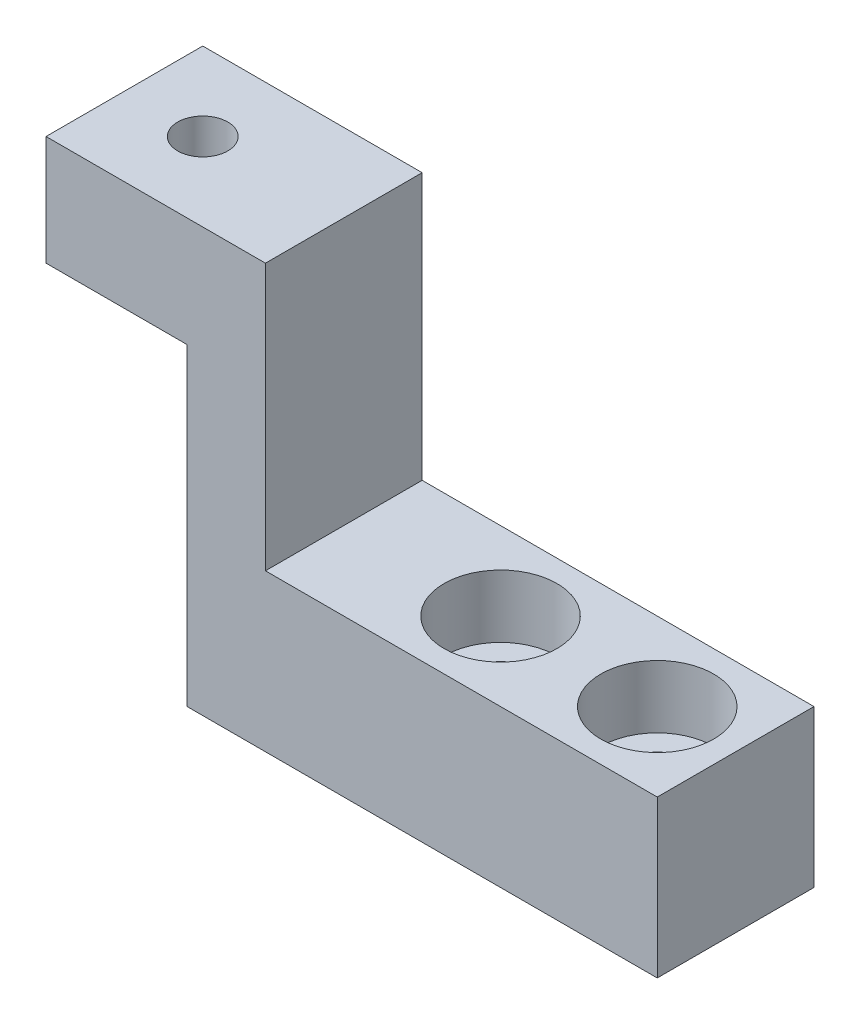
ISO-10303-21;
HEADER;
FILE_DESCRIPTION(('STEP AP214'),'2;1');
FILE_NAME('part.step','',(''),(''),'','','');
FILE_SCHEMA(('AUTOMOTIVE_DESIGN { 1 0 10303 214 1 1 1 1 }'));
ENDSEC;
DATA;
#1=APPLICATION_CONTEXT('core data for automotive mechanical design processes');
#2=APPLICATION_PROTOCOL_DEFINITION('international standard','automotive_design',2000,#1);
#3=PRODUCT_CONTEXT('',#1,'mechanical');
#4=PRODUCT('Part','Part','',(#3));
#5=PRODUCT_RELATED_PRODUCT_CATEGORY('part','',(#4));
#6=PRODUCT_DEFINITION_FORMATION('','',#4);
#7=PRODUCT_DEFINITION_CONTEXT('part definition',#1,'design');
#8=PRODUCT_DEFINITION('design','',#6,#7);
#9=PRODUCT_DEFINITION_SHAPE('','',#8);
#10=(LENGTH_UNIT() NAMED_UNIT(*) SI_UNIT(.MILLI.,.METRE.));
#11=(NAMED_UNIT(*) PLANE_ANGLE_UNIT() SI_UNIT($,.RADIAN.));
#12=(NAMED_UNIT(*) SI_UNIT($,.STERADIAN.) SOLID_ANGLE_UNIT());
#13=UNCERTAINTY_MEASURE_WITH_UNIT(LENGTH_MEASURE(1.E-05),#10,'distance_accuracy_value','');
#14=(GEOMETRIC_REPRESENTATION_CONTEXT(3) GLOBAL_UNCERTAINTY_ASSIGNED_CONTEXT((#13)) GLOBAL_UNIT_ASSIGNED_CONTEXT((#10,
#11,#12)) REPRESENTATION_CONTEXT('',''));
#15=CARTESIAN_POINT('',(0.,0.,0.));
#16=DIRECTION('',(0.,0.,1.));
#17=DIRECTION('',(1.,0.,0.));
#18=AXIS2_PLACEMENT_3D('',#15,#16,#17);
#19=CARTESIAN_POINT('',(-5.,-0.001000000000001,5.));
#20=DIRECTION('',(0.,1.,0.));
#21=DIRECTION('',(0.,0.,1.));
#22=AXIS2_PLACEMENT_3D('',#19,#20,#21);
#23=CYLINDRICAL_SURFACE('',#22,2.1);
#24=CARTESIAN_POINT('',(-5.,0.,5.));
#25=DIRECTION('',(0.,-1.,0.));
#26=DIRECTION('',(1.,0.,0.));
#27=AXIS2_PLACEMENT_3D('',#24,#25,#26);
#28=CIRCLE('',#27,2.1);
#29=CARTESIAN_POINT('',(-2.9,0.,5.));
#30=VERTEX_POINT('',#29);
#31=EDGE_CURVE('E122',#30,#30,#28,.F.);
#32=ORIENTED_EDGE('',*,*,#31,.F.);
#33=EDGE_LOOP('',(#32));
#34=FACE_BOUND('',#33,.T.);
#35=CARTESIAN_POINT('',(-5.,6.,5.));
#36=DIRECTION('',(0.,1.,0.));
#37=DIRECTION('',(0.,0.,1.));
#38=AXIS2_PLACEMENT_3D('',#35,#36,#37);
#39=CIRCLE('',#38,2.1);
#40=CARTESIAN_POINT('',(-5.,6.,7.10000000000001));
#41=VERTEX_POINT('',#40);
#42=EDGE_CURVE('E40',#41,#41,#39,.F.);
#43=ORIENTED_EDGE('',*,*,#42,.F.);
#44=EDGE_LOOP('',(#43));
#45=FACE_BOUND('',#44,.T.);
#46=ADVANCED_FACE('F36',(#34,#45),#23,.F.);
#47=CARTESIAN_POINT('',(-15.,0.,5.));
#48=DIRECTION('',(0.,1.,0.));
#49=DIRECTION('',(0.,0.,1.));
#50=AXIS2_PLACEMENT_3D('',#47,#48,#49);
#51=CYLINDRICAL_SURFACE('',#50,2.1);
#52=CARTESIAN_POINT('',(-15.,0.,5.));
#53=DIRECTION('',(0.,1.,0.));
#54=DIRECTION('',(0.,0.,1.));
#55=AXIS2_PLACEMENT_3D('',#52,#53,#54);
#56=CIRCLE('',#55,2.1);
#57=CARTESIAN_POINT('',(-15.,0.,7.10000000000001));
#58=VERTEX_POINT('',#57);
#59=EDGE_CURVE('E125',#58,#58,#56,.T.);
#60=ORIENTED_EDGE('',*,*,#59,.F.);
#61=EDGE_LOOP('',(#60));
#62=FACE_BOUND('',#61,.T.);
#63=CARTESIAN_POINT('',(-15.,6.,5.));
#64=DIRECTION('',(0.,1.,0.));
#65=DIRECTION('',(0.,0.,1.));
#66=AXIS2_PLACEMENT_3D('',#63,#64,#65);
#67=CIRCLE('',#66,2.1);
#68=CARTESIAN_POINT('',(-15.,6.,7.10000000000001));
#69=VERTEX_POINT('',#68);
#70=EDGE_CURVE('E169',#69,#69,#67,.F.);
#71=ORIENTED_EDGE('',*,*,#70,.F.);
#72=EDGE_LOOP('',(#71));
#73=FACE_BOUND('',#72,.T.);
#74=ADVANCED_FACE('F231',(#62,#73),#51,.F.);
#75=CARTESIAN_POINT('',(0.,10.,10.));
#76=DIRECTION('',(1.,0.,0.));
#77=DIRECTION('',(0.,1.,0.));
#78=AXIS2_PLACEMENT_3D('',#75,#76,#77);
#79=PLANE('',#78);
#80=DIRECTION('',(0.,-1.,0.));
#81=VECTOR('',#80,1.);
#82=CARTESIAN_POINT('',(0.,10.,0.));
#83=LINE('',#82,#81);
#84=CARTESIAN_POINT('',(0.,10.,0.));
#85=VERTEX_POINT('',#84);
#86=CARTESIAN_POINT('',(0.,0.,0.));
#87=VERTEX_POINT('',#86);
#88=EDGE_CURVE('E102',#85,#87,#83,.T.);
#89=ORIENTED_EDGE('',*,*,#88,.F.);
#90=DIRECTION('',(0.,0.,-1.));
#91=VECTOR('',#90,1.);
#92=CARTESIAN_POINT('',(0.,10.,10.));
#93=LINE('',#92,#91);
#94=CARTESIAN_POINT('',(0.,10.,10.));
#95=VERTEX_POINT('',#94);
#96=EDGE_CURVE('E11',#95,#85,#93,.T.);
#97=ORIENTED_EDGE('',*,*,#96,.F.);
#98=DIRECTION('',(0.,-1.,0.));
#99=VECTOR('',#98,1.);
#100=CARTESIAN_POINT('',(0.,10.,10.));
#101=LINE('',#100,#99);
#102=CARTESIAN_POINT('',(0.,0.,10.));
#103=VERTEX_POINT('',#102);
#104=EDGE_CURVE('E104',#95,#103,#101,.T.);
#105=ORIENTED_EDGE('',*,*,#104,.T.);
#106=DIRECTION('',(0.,0.,-1.));
#107=VECTOR('',#106,1.);
#108=CARTESIAN_POINT('',(0.,0.,10.));
#109=LINE('',#108,#107);
#110=EDGE_CURVE('E99',#103,#87,#109,.T.);
#111=ORIENTED_EDGE('',*,*,#110,.T.);
#112=EDGE_LOOP('',(#89,#97,#105,#111));
#113=FACE_BOUND('',#112,.T.);
#114=ADVANCED_FACE('F38',(#113),#79,.T.);
#115=CARTESIAN_POINT('',(-25.,9.99999999999997,10.));
#116=DIRECTION('',(0.,1.,0.));
#117=DIRECTION('',(0.,0.,1.));
#118=AXIS2_PLACEMENT_3D('',#115,#116,#117);
#119=PLANE('',#118);
#120=CARTESIAN_POINT('',(-5.,10.,5.));
#121=DIRECTION('',(0.,1.,0.));
#122=DIRECTION('',(0.,0.,1.));
#123=AXIS2_PLACEMENT_3D('',#120,#121,#122);
#124=CIRCLE('',#123,3.6);
#125=CARTESIAN_POINT('',(-5.,10.,8.60000000000001));
#126=VERTEX_POINT('',#125);
#127=EDGE_CURVE('E186',#126,#126,#124,.T.);
#128=ORIENTED_EDGE('',*,*,#127,.F.);
#129=EDGE_LOOP('',(#128));
#130=FACE_BOUND('',#129,.T.);
#131=CARTESIAN_POINT('',(-15.,9.99999999999997,5.));
#132=DIRECTION('',(0.,1.,0.));
#133=DIRECTION('',(0.,0.,1.));
#134=AXIS2_PLACEMENT_3D('',#131,#132,#133);
#135=CIRCLE('',#134,3.6);
#136=CARTESIAN_POINT('',(-15.,9.99999999999997,8.6));
#137=VERTEX_POINT('',#136);
#138=EDGE_CURVE('E176',#137,#137,#135,.T.);
#139=ORIENTED_EDGE('',*,*,#138,.F.);
#140=EDGE_LOOP('',(#139));
#141=FACE_BOUND('',#140,.T.);
#142=DIRECTION('',(1.,0.,0.));
#143=VECTOR('',#142,1.);
#144=CARTESIAN_POINT('',(-25.,10.,0.));
#145=LINE('',#144,#143);
#146=CARTESIAN_POINT('',(-25.,10.,0.));
#147=VERTEX_POINT('',#146);
#148=EDGE_CURVE('E121',#147,#85,#145,.T.);
#149=ORIENTED_EDGE('',*,*,#148,.F.);
#150=DIRECTION('',(0.,0.,-1.));
#151=VECTOR('',#150,1.);
#152=CARTESIAN_POINT('',(-25.,9.99999999999997,10.));
#153=LINE('',#152,#151);
#154=CARTESIAN_POINT('',(-25.,9.99999999999997,10.));
#155=VERTEX_POINT('',#154);
#156=EDGE_CURVE('E45',#155,#147,#153,.T.);
#157=ORIENTED_EDGE('',*,*,#156,.F.);
#158=DIRECTION('',(1.,0.,0.));
#159=VECTOR('',#158,1.);
#160=CARTESIAN_POINT('',(-25.,9.99999999999997,10.));
#161=LINE('',#160,#159);
#162=EDGE_CURVE('E109',#155,#95,#161,.T.);
#163=ORIENTED_EDGE('',*,*,#162,.T.);
#164=ORIENTED_EDGE('',*,*,#96,.T.);
#165=EDGE_LOOP('',(#149,#157,#163,#164));
#166=FACE_BOUND('',#165,.T.);
#167=ADVANCED_FACE('F221',(#130,#141,#166),#119,.T.);
#168=CARTESIAN_POINT('',(-25.,27.,10.));
#169=DIRECTION('',(1.,0.,0.));
#170=DIRECTION('',(0.,1.,0.));
#171=AXIS2_PLACEMENT_3D('',#168,#169,#170);
#172=PLANE('',#171);
#173=DIRECTION('',(0.,-1.,0.));
#174=VECTOR('',#173,1.);
#175=CARTESIAN_POINT('',(-25.,27.,0.));
#176=LINE('',#175,#174);
#177=CARTESIAN_POINT('',(-25.,27.,0.));
#178=VERTEX_POINT('',#177);
#179=EDGE_CURVE('E139',#178,#147,#176,.T.);
#180=ORIENTED_EDGE('',*,*,#179,.F.);
#181=DIRECTION('',(0.,0.,-1.));
#182=VECTOR('',#181,1.);
#183=CARTESIAN_POINT('',(-25.,27.,10.));
#184=LINE('',#183,#182);
#185=CARTESIAN_POINT('',(-25.,27.,10.));
#186=VERTEX_POINT('',#185);
#187=EDGE_CURVE('E161',#186,#178,#184,.T.);
#188=ORIENTED_EDGE('',*,*,#187,.F.);
#189=DIRECTION('',(0.,-1.,0.));
#190=VECTOR('',#189,1.);
#191=CARTESIAN_POINT('',(-25.,27.,10.));
#192=LINE('',#191,#190);
#193=EDGE_CURVE('E157',#186,#155,#192,.T.);
#194=ORIENTED_EDGE('',*,*,#193,.T.);
#195=ORIENTED_EDGE('',*,*,#156,.T.);
#196=EDGE_LOOP('',(#180,#188,#194,#195));
#197=FACE_BOUND('',#196,.T.);
#198=ADVANCED_FACE('F202',(#197),#172,.T.);
#199=CARTESIAN_POINT('',(-39.,27.,10.));
#200=DIRECTION('',(0.,1.,0.));
#201=DIRECTION('',(0.,0.,1.));
#202=AXIS2_PLACEMENT_3D('',#199,#200,#201);
#203=PLANE('',#202);
#204=CARTESIAN_POINT('',(-34.,27.,4.99999999999989));
#205=DIRECTION('',(0.,1.,0.));
#206=DIRECTION('',(0.,0.,1.));
#207=AXIS2_PLACEMENT_3D('',#204,#205,#206);
#208=CIRCLE('',#207,1.6);
#209=CARTESIAN_POINT('',(-34.,27.,6.59999999999995));
#210=VERTEX_POINT('',#209);
#211=EDGE_CURVE('E189',#210,#210,#208,.T.);
#212=ORIENTED_EDGE('',*,*,#211,.F.);
#213=EDGE_LOOP('',(#212));
#214=FACE_BOUND('',#213,.T.);
#215=DIRECTION('',(1.,0.,0.));
#216=VECTOR('',#215,1.);
#217=CARTESIAN_POINT('',(-39.,27.,0.));
#218=LINE('',#217,#216);
#219=CARTESIAN_POINT('',(-39.,27.,0.));
#220=VERTEX_POINT('',#219);
#221=EDGE_CURVE('E136',#220,#178,#218,.T.);
#222=ORIENTED_EDGE('',*,*,#221,.F.);
#223=DIRECTION('',(0.,0.,-1.));
#224=VECTOR('',#223,1.);
#225=CARTESIAN_POINT('',(-39.,27.,10.));
#226=LINE('',#225,#224);
#227=CARTESIAN_POINT('',(-39.,27.,10.));
#228=VERTEX_POINT('',#227);
#229=EDGE_CURVE('E163',#228,#220,#226,.T.);
#230=ORIENTED_EDGE('',*,*,#229,.F.);
#231=DIRECTION('',(1.,0.,0.));
#232=VECTOR('',#231,1.);
#233=CARTESIAN_POINT('',(-39.,27.,10.));
#234=LINE('',#233,#232);
#235=EDGE_CURVE('E154',#228,#186,#234,.T.);
#236=ORIENTED_EDGE('',*,*,#235,.T.);
#237=ORIENTED_EDGE('',*,*,#187,.T.);
#238=EDGE_LOOP('',(#222,#230,#236,#237));
#239=FACE_BOUND('',#238,.T.);
#240=ADVANCED_FACE('F198',(#214,#239),#203,.T.);
#241=CARTESIAN_POINT('',(-39.,20.,10.));
#242=DIRECTION('',(-1.,0.,0.));
#243=DIRECTION('',(0.,0.,1.));
#244=AXIS2_PLACEMENT_3D('',#241,#242,#243);
#245=PLANE('',#244);
#246=DIRECTION('',(0.,1.,0.));
#247=VECTOR('',#246,1.);
#248=CARTESIAN_POINT('',(-39.,20.,0.));
#249=LINE('',#248,#247);
#250=CARTESIAN_POINT('',(-39.,20.,0.));
#251=VERTEX_POINT('',#250);
#252=EDGE_CURVE('E133',#251,#220,#249,.T.);
#253=ORIENTED_EDGE('',*,*,#252,.F.);
#254=DIRECTION('',(0.,0.,-1.));
#255=VECTOR('',#254,1.);
#256=CARTESIAN_POINT('',(-39.,20.,10.));
#257=LINE('',#256,#255);
#258=CARTESIAN_POINT('',(-39.,20.,10.));
#259=VERTEX_POINT('',#258);
#260=EDGE_CURVE('E165',#259,#251,#257,.T.);
#261=ORIENTED_EDGE('',*,*,#260,.F.);
#262=DIRECTION('',(0.,1.,0.));
#263=VECTOR('',#262,1.);
#264=CARTESIAN_POINT('',(-39.,20.,10.));
#265=LINE('',#264,#263);
#266=EDGE_CURVE('E151',#259,#228,#265,.T.);
#267=ORIENTED_EDGE('',*,*,#266,.T.);
#268=ORIENTED_EDGE('',*,*,#229,.T.);
#269=EDGE_LOOP('',(#253,#261,#267,#268));
#270=FACE_BOUND('',#269,.T.);
#271=ADVANCED_FACE('F201',(#270),#245,.T.);
#272=CARTESIAN_POINT('',(-30.,20.,10.));
#273=DIRECTION('',(0.,-1.,0.));
#274=DIRECTION('',(0.,0.,-1.));
#275=AXIS2_PLACEMENT_3D('',#272,#273,#274);
#276=PLANE('',#275);
#277=CARTESIAN_POINT('',(-34.,20.,4.99999999999995));
#278=DIRECTION('',(0.,-1.,0.));
#279=DIRECTION('',(0.,0.,-1.));
#280=AXIS2_PLACEMENT_3D('',#277,#278,#279);
#281=CIRCLE('',#280,1.6);
#282=CARTESIAN_POINT('',(-34.,20.,6.59999999999995));
#283=VERTEX_POINT('',#282);
#284=EDGE_CURVE('E190',#283,#283,#281,.F.);
#285=ORIENTED_EDGE('',*,*,#284,.T.);
#286=EDGE_LOOP('',(#285));
#287=FACE_BOUND('',#286,.T.);
#288=DIRECTION('',(-1.,0.,0.));
#289=VECTOR('',#288,1.);
#290=CARTESIAN_POINT('',(-30.,20.,0.));
#291=LINE('',#290,#289);
#292=CARTESIAN_POINT('',(-30.,20.,0.));
#293=VERTEX_POINT('',#292);
#294=EDGE_CURVE('E130',#293,#251,#291,.T.);
#295=ORIENTED_EDGE('',*,*,#294,.F.);
#296=DIRECTION('',(0.,0.,-1.));
#297=VECTOR('',#296,1.);
#298=CARTESIAN_POINT('',(-30.,20.,10.));
#299=LINE('',#298,#297);
#300=CARTESIAN_POINT('',(-30.,20.,10.));
#301=VERTEX_POINT('',#300);
#302=EDGE_CURVE('E167',#301,#293,#299,.T.);
#303=ORIENTED_EDGE('',*,*,#302,.F.);
#304=DIRECTION('',(-1.,0.,0.));
#305=VECTOR('',#304,1.);
#306=CARTESIAN_POINT('',(-30.,20.,10.));
#307=LINE('',#306,#305);
#308=EDGE_CURVE('E148',#301,#259,#307,.T.);
#309=ORIENTED_EDGE('',*,*,#308,.T.);
#310=ORIENTED_EDGE('',*,*,#260,.T.);
#311=EDGE_LOOP('',(#295,#303,#309,#310));
#312=FACE_BOUND('',#311,.T.);
#313=ADVANCED_FACE('F217',(#287,#312),#276,.T.);
#314=CARTESIAN_POINT('',(-30.,0.,10.));
#315=DIRECTION('',(-1.,0.,0.));
#316=DIRECTION('',(0.,0.,1.));
#317=AXIS2_PLACEMENT_3D('',#314,#315,#316);
#318=PLANE('',#317);
#319=DIRECTION('',(0.,1.,0.));
#320=VECTOR('',#319,1.);
#321=CARTESIAN_POINT('',(-30.,0.,0.));
#322=LINE('',#321,#320);
#323=CARTESIAN_POINT('',(-30.,0.,0.));
#324=VERTEX_POINT('',#323);
#325=EDGE_CURVE('E117',#324,#293,#322,.T.);
#326=ORIENTED_EDGE('',*,*,#325,.F.);
#327=DIRECTION('',(0.,0.,-1.));
#328=VECTOR('',#327,1.);
#329=CARTESIAN_POINT('',(-30.,0.,10.));
#330=LINE('',#329,#328);
#331=CARTESIAN_POINT('',(-30.,0.,10.));
#332=VERTEX_POINT('',#331);
#333=EDGE_CURVE('E108',#332,#324,#330,.T.);
#334=ORIENTED_EDGE('',*,*,#333,.F.);
#335=DIRECTION('',(0.,1.,0.));
#336=VECTOR('',#335,1.);
#337=CARTESIAN_POINT('',(-30.,0.,10.));
#338=LINE('',#337,#336);
#339=EDGE_CURVE('E145',#332,#301,#338,.T.);
#340=ORIENTED_EDGE('',*,*,#339,.T.);
#341=ORIENTED_EDGE('',*,*,#302,.T.);
#342=EDGE_LOOP('',(#326,#334,#340,#341));
#343=FACE_BOUND('',#342,.T.);
#344=ADVANCED_FACE('F219',(#343),#318,.T.);
#345=CARTESIAN_POINT('',(0.,0.,10.));
#346=DIRECTION('',(0.,-1.,0.));
#347=DIRECTION('',(1.,0.,0.));
#348=AXIS2_PLACEMENT_3D('',#345,#346,#347);
#349=PLANE('',#348);
#350=ORIENTED_EDGE('',*,*,#59,.T.);
#351=EDGE_LOOP('',(#350));
#352=FACE_BOUND('',#351,.T.);
#353=ORIENTED_EDGE('',*,*,#31,.T.);
#354=EDGE_LOOP('',(#353));
#355=FACE_BOUND('',#354,.T.);
#356=DIRECTION('',(-1.,0.,0.));
#357=VECTOR('',#356,1.);
#358=CARTESIAN_POINT('',(0.,0.,0.));
#359=LINE('',#358,#357);
#360=EDGE_CURVE('E112',#87,#324,#359,.T.);
#361=ORIENTED_EDGE('',*,*,#360,.F.);
#362=ORIENTED_EDGE('',*,*,#110,.F.);
#363=DIRECTION('',(-1.,0.,0.));
#364=VECTOR('',#363,1.);
#365=CARTESIAN_POINT('',(0.,0.,10.));
#366=LINE('',#365,#364);
#367=EDGE_CURVE('E143',#103,#332,#366,.T.);
#368=ORIENTED_EDGE('',*,*,#367,.T.);
#369=ORIENTED_EDGE('',*,*,#333,.T.);
#370=EDGE_LOOP('',(#361,#362,#368,#369));
#371=FACE_BOUND('',#370,.T.);
#372=ADVANCED_FACE('F113',(#352,#355,#371),#349,.T.);
#373=CARTESIAN_POINT('',(0.,20.,10.));
#374=DIRECTION('',(0.,0.,-1.));
#375=DIRECTION('',(-1.,0.,0.));
#376=AXIS2_PLACEMENT_3D('',#373,#374,#375);
#377=PLANE('',#376);
#378=ORIENTED_EDGE('',*,*,#104,.F.);
#379=ORIENTED_EDGE('',*,*,#162,.F.);
#380=ORIENTED_EDGE('',*,*,#193,.F.);
#381=ORIENTED_EDGE('',*,*,#235,.F.);
#382=ORIENTED_EDGE('',*,*,#266,.F.);
#383=ORIENTED_EDGE('',*,*,#308,.F.);
#384=ORIENTED_EDGE('',*,*,#339,.F.);
#385=ORIENTED_EDGE('',*,*,#367,.F.);
#386=EDGE_LOOP('',(#378,#379,#380,#381,#382,#383,#384,#385));
#387=FACE_BOUND('',#386,.T.);
#388=ADVANCED_FACE('F213',(#387),#377,.F.);
#389=CARTESIAN_POINT('',(0.,20.0000000000001,0.));
#390=DIRECTION('',(0.,0.,-1.));
#391=DIRECTION('',(-1.,0.,0.));
#392=AXIS2_PLACEMENT_3D('',#389,#390,#391);
#393=PLANE('',#392);
#394=ORIENTED_EDGE('',*,*,#88,.T.);
#395=ORIENTED_EDGE('',*,*,#360,.T.);
#396=ORIENTED_EDGE('',*,*,#325,.T.);
#397=ORIENTED_EDGE('',*,*,#294,.T.);
#398=ORIENTED_EDGE('',*,*,#252,.T.);
#399=ORIENTED_EDGE('',*,*,#221,.T.);
#400=ORIENTED_EDGE('',*,*,#179,.T.);
#401=ORIENTED_EDGE('',*,*,#148,.T.);
#402=EDGE_LOOP('',(#394,#395,#396,#397,#398,#399,#400,#401));
#403=FACE_BOUND('',#402,.T.);
#404=ADVANCED_FACE('F119',(#403),#393,.T.);
#405=CARTESIAN_POINT('',(-15.,6.,5.));
#406=DIRECTION('',(0.,1.,0.));
#407=DIRECTION('',(0.,0.,1.));
#408=AXIS2_PLACEMENT_3D('',#405,#406,#407);
#409=PLANE('',#408);
#410=CARTESIAN_POINT('',(-15.,6.,5.));
#411=DIRECTION('',(0.,1.,0.));
#412=DIRECTION('',(0.,0.,1.));
#413=AXIS2_PLACEMENT_3D('',#410,#411,#412);
#414=CIRCLE('',#413,3.6);
#415=CARTESIAN_POINT('',(-15.,6.,8.6));
#416=VERTEX_POINT('',#415);
#417=EDGE_CURVE('E171',#416,#416,#414,.T.);
#418=ORIENTED_EDGE('',*,*,#417,.T.);
#419=EDGE_LOOP('',(#418));
#420=FACE_BOUND('',#419,.T.);
#421=ORIENTED_EDGE('',*,*,#70,.T.);
#422=EDGE_LOOP('',(#421));
#423=FACE_BOUND('',#422,.T.);
#424=ADVANCED_FACE('F248',(#420,#423),#409,.T.);
#425=CARTESIAN_POINT('',(-15.,6.,5.));
#426=DIRECTION('',(0.,1.,0.));
#427=DIRECTION('',(0.,0.,1.));
#428=AXIS2_PLACEMENT_3D('',#425,#426,#427);
#429=CYLINDRICAL_SURFACE('',#428,3.6);
#430=ORIENTED_EDGE('',*,*,#417,.F.);
#431=EDGE_LOOP('',(#430));
#432=FACE_BOUND('',#431,.T.);
#433=ORIENTED_EDGE('',*,*,#138,.T.);
#434=EDGE_LOOP('',(#433));
#435=FACE_BOUND('',#434,.T.);
#436=ADVANCED_FACE('F303',(#432,#435),#429,.F.);
#437=CARTESIAN_POINT('',(-5.,6.,5.));
#438=DIRECTION('',(0.,1.,0.));
#439=DIRECTION('',(0.,0.,1.));
#440=AXIS2_PLACEMENT_3D('',#437,#438,#439);
#441=PLANE('',#440);
#442=CARTESIAN_POINT('',(-5.,6.,5.));
#443=DIRECTION('',(0.,1.,0.));
#444=DIRECTION('',(0.,0.,1.));
#445=AXIS2_PLACEMENT_3D('',#442,#443,#444);
#446=CIRCLE('',#445,3.6);
#447=CARTESIAN_POINT('',(-5.,6.,8.60000000000001));
#448=VERTEX_POINT('',#447);
#449=EDGE_CURVE('E183',#448,#448,#446,.T.);
#450=ORIENTED_EDGE('',*,*,#449,.T.);
#451=EDGE_LOOP('',(#450));
#452=FACE_BOUND('',#451,.T.);
#453=ORIENTED_EDGE('',*,*,#42,.T.);
#454=EDGE_LOOP('',(#453));
#455=FACE_BOUND('',#454,.T.);
#456=ADVANCED_FACE('F312',(#452,#455),#441,.T.);
#457=CARTESIAN_POINT('',(-5.,6.,5.));
#458=DIRECTION('',(0.,1.,0.));
#459=DIRECTION('',(0.,0.,1.));
#460=AXIS2_PLACEMENT_3D('',#457,#458,#459);
#461=CYLINDRICAL_SURFACE('',#460,3.6);
#462=ORIENTED_EDGE('',*,*,#449,.F.);
#463=EDGE_LOOP('',(#462));
#464=FACE_BOUND('',#463,.T.);
#465=ORIENTED_EDGE('',*,*,#127,.T.);
#466=EDGE_LOOP('',(#465));
#467=FACE_BOUND('',#466,.T.);
#468=ADVANCED_FACE('F322',(#464,#467),#461,.F.);
#469=CARTESIAN_POINT('',(-34.,-0.000999999999980183,4.99999999999995));
#470=DIRECTION('',(0.,1.,0.));
#471=DIRECTION('',(0.,0.,1.));
#472=AXIS2_PLACEMENT_3D('',#469,#470,#471);
#473=CYLINDRICAL_SURFACE('',#472,1.6);
#474=CARTESIAN_POINT('',(-34.,20.,6.59999999999995));
#475=CARTESIAN_POINT('',(-34.,20.0729166666666,6.59999999999995));
#476=CARTESIAN_POINT('',(-34.,20.1458333333333,6.59999999999995));
#477=CARTESIAN_POINT('',(-34.,20.2916666666666,6.59999999999995));
#478=CARTESIAN_POINT('',(-34.,20.3645833333333,6.59999999999995));
#479=CARTESIAN_POINT('',(-34.,20.5104166666666,6.59999999999995));
#480=CARTESIAN_POINT('',(-34.,20.5833333333333,6.59999999999995));
#481=CARTESIAN_POINT('',(-34.,20.7291666666666,6.59999999999995));
#482=CARTESIAN_POINT('',(-34.,20.8020833333333,6.59999999999995));
#483=CARTESIAN_POINT('',(-34.,20.9479166666666,6.59999999999995));
#484=CARTESIAN_POINT('',(-34.,21.0208333333333,6.59999999999995));
#485=CARTESIAN_POINT('',(-34.,21.1666666666666,6.59999999999995));
#486=CARTESIAN_POINT('',(-34.,21.2395833333333,6.59999999999995));
#487=CARTESIAN_POINT('',(-34.,21.3854166666666,6.59999999999995));
#488=CARTESIAN_POINT('',(-34.,21.4583333333333,6.59999999999995));
#489=CARTESIAN_POINT('',(-34.,21.6041666666666,6.59999999999995));
#490=CARTESIAN_POINT('',(-34.,21.6770833333333,6.59999999999995));
#491=CARTESIAN_POINT('',(-34.,21.8229166666666,6.59999999999995));
#492=CARTESIAN_POINT('',(-34.,21.8958333333333,6.59999999999995));
#493=CARTESIAN_POINT('',(-34.,22.0416666666666,6.59999999999995));
#494=CARTESIAN_POINT('',(-34.,22.1145833333333,6.59999999999995));
#495=CARTESIAN_POINT('',(-34.,22.2604166666666,6.59999999999995));
#496=CARTESIAN_POINT('',(-34.,22.3333333333333,6.59999999999995));
#497=CARTESIAN_POINT('',(-34.,22.4791666666666,6.59999999999995));
#498=CARTESIAN_POINT('',(-34.,22.5520833333333,6.59999999999995));
#499=CARTESIAN_POINT('',(-34.,22.6979166666666,6.59999999999995));
#500=CARTESIAN_POINT('',(-34.,22.7708333333333,6.59999999999995));
#501=CARTESIAN_POINT('',(-34.,22.9166666666666,6.59999999999995));
#502=CARTESIAN_POINT('',(-34.,22.9895833333333,6.59999999999995));
#503=CARTESIAN_POINT('',(-34.,23.1354166666666,6.59999999999995));
#504=CARTESIAN_POINT('',(-34.,23.2083333333333,6.59999999999995));
#505=CARTESIAN_POINT('',(-34.,23.3541666666666,6.59999999999995));
#506=CARTESIAN_POINT('',(-34.,23.4270833333333,6.59999999999995));
#507=CARTESIAN_POINT('',(-34.,23.5729166666666,6.59999999999995));
#508=CARTESIAN_POINT('',(-34.,23.6458333333333,6.59999999999995));
#509=CARTESIAN_POINT('',(-34.,23.7916666666666,6.59999999999995));
#510=CARTESIAN_POINT('',(-34.,23.8645833333333,6.59999999999995));
#511=CARTESIAN_POINT('',(-34.,24.0104166666666,6.59999999999995));
#512=CARTESIAN_POINT('',(-34.,24.0833333333333,6.59999999999995));
#513=CARTESIAN_POINT('',(-34.,24.2291666666666,6.59999999999995));
#514=CARTESIAN_POINT('',(-34.,24.3020833333333,6.59999999999995));
#515=CARTESIAN_POINT('',(-34.,24.4479166666666,6.59999999999995));
#516=CARTESIAN_POINT('',(-34.,24.5208333333333,6.59999999999995));
#517=CARTESIAN_POINT('',(-34.,24.6666666666666,6.59999999999995));
#518=CARTESIAN_POINT('',(-34.,24.7395833333333,6.59999999999995));
#519=CARTESIAN_POINT('',(-34.,24.8854166666666,6.59999999999995));
#520=CARTESIAN_POINT('',(-34.,24.9583333333333,6.59999999999995));
#521=CARTESIAN_POINT('',(-34.,25.1041666666666,6.59999999999995));
#522=CARTESIAN_POINT('',(-34.,25.1770833333333,6.59999999999995));
#523=CARTESIAN_POINT('',(-34.,25.3229166666666,6.59999999999995));
#524=CARTESIAN_POINT('',(-34.,25.3958333333333,6.59999999999995));
#525=CARTESIAN_POINT('',(-34.,25.5416666666666,6.59999999999995));
#526=CARTESIAN_POINT('',(-34.,25.6145833333333,6.59999999999995));
#527=CARTESIAN_POINT('',(-34.,25.7604166666666,6.59999999999995));
#528=CARTESIAN_POINT('',(-34.,25.8333333333333,6.59999999999995));
#529=CARTESIAN_POINT('',(-34.,25.9791666666666,6.59999999999995));
#530=CARTESIAN_POINT('',(-34.,26.0520833333333,6.59999999999995));
#531=CARTESIAN_POINT('',(-34.,26.1979166666666,6.59999999999995));
#532=CARTESIAN_POINT('',(-34.,26.2708333333333,6.59999999999995));
#533=CARTESIAN_POINT('',(-34.,26.4166666666666,6.59999999999995));
#534=CARTESIAN_POINT('',(-34.,26.4895833333333,6.59999999999995));
#535=CARTESIAN_POINT('',(-34.,26.6354166666666,6.59999999999995));
#536=CARTESIAN_POINT('',(-34.,26.7083333333333,6.59999999999995));
#537=CARTESIAN_POINT('',(-34.,26.8541666666666,6.59999999999995));
#538=CARTESIAN_POINT('',(-34.,26.9270833333333,6.59999999999995));
#539=CARTESIAN_POINT('',(-34.,27.,6.59999999999995));
#540=B_SPLINE_CURVE_WITH_KNOTS('',3,(#474,#475,#476,#477,#478,#479,#480,#481,#482,#483,#484,
#485,#486,#487,#488,#489,#490,#491,#492,#493,#494,#495,#496,#497,#498,#499,#500,#501,#502,#503,
#504,#505,#506,#507,#508,#509,#510,#511,#512,#513,#514,#515,#516,#517,#518,#519,#520,#521,#522,
#523,#524,#525,#526,#527,#528,#529,#530,#531,#532,#533,#534,#535,#536,#537,#538,#539),
.UNSPECIFIED.,.F.,.F.,(4,2,2,2,2,2,2,2,2,2,2,2,2,2,2,2,2,2,2,2,2,2,2,2,2,2,2,2,2,2,2,2,4),(0.,
0.21875,0.4375,0.656250000000001,0.875000000000001,1.09375,1.3125,1.53125,1.75,1.96875,2.1875,
2.40625,2.625,2.84375,3.0625,3.28125,3.5,3.71875,3.9375,4.15624999999999,4.375,4.59374999999999,
4.81249999999999,5.03124999999999,5.24999999999999,5.46874999999999,5.68749999999999,
5.90624999999999,6.12499999999999,6.34375,6.56249999999999,6.78124999999999,6.99999999999999),.UNSPECIFIED.);
#541=EDGE_CURVE('BSEAM196',#283,#210,#540,.T.);
#542=ORIENTED_EDGE('',*,*,#284,.F.);
#543=ORIENTED_EDGE('',*,*,#211,.T.);
#544=ORIENTED_EDGE('',*,*,#541,.T.);
#545=ORIENTED_EDGE('',*,*,#541,.F.);
#546=EDGE_LOOP('',(#542,#544,#543,#545));
#547=FACE_BOUND('',#546,.T.);
#548=ADVANCED_FACE('F196',(#547),#473,.F.);
#549=CLOSED_SHELL('',(#46,#74,#114,#167,#198,#240,#271,#313,#344,#372,#388,#404,#424,#436,#456,
#468,#548));
#550=MANIFOLD_SOLID_BREP('B2',#549);
#551=ADVANCED_BREP_SHAPE_REPRESENTATION('',(#18,#550),#14);
#552=SHAPE_DEFINITION_REPRESENTATION(#9,#551);
ENDSEC;
END-ISO-10303-21;
